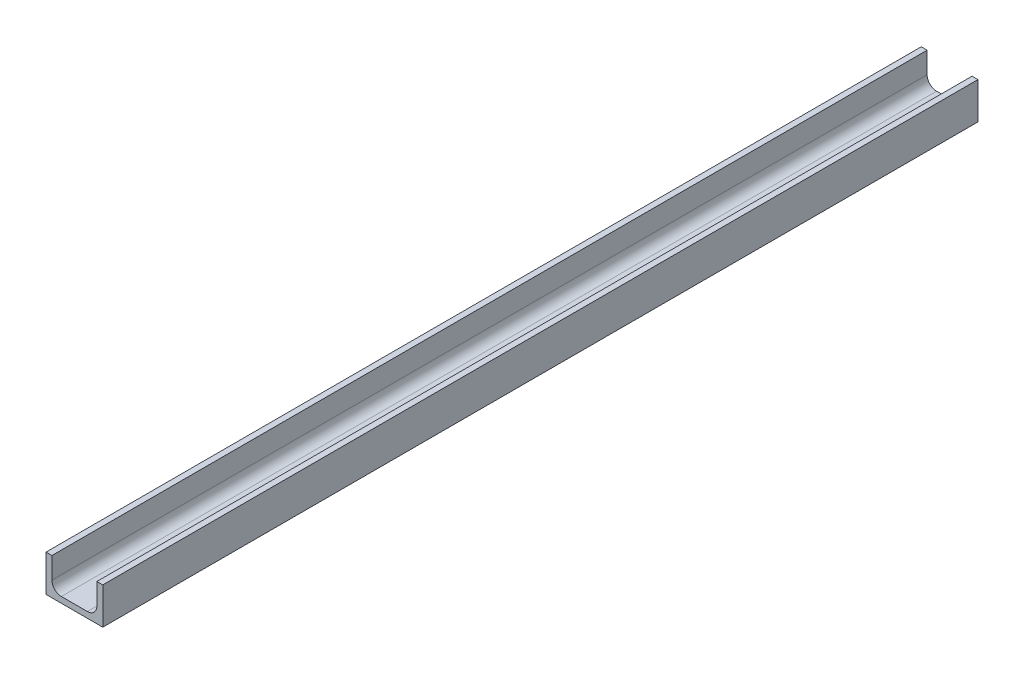
ISO-10303-21;
HEADER;
FILE_DESCRIPTION(('STEP AP214'),'2;1');
FILE_NAME('part.step','',(''),(''),'','','');
FILE_SCHEMA(('AUTOMOTIVE_DESIGN { 1 0 10303 214 1 1 1 1 }'));
ENDSEC;
DATA;
#1=APPLICATION_CONTEXT('core data for automotive mechanical design processes');
#2=APPLICATION_PROTOCOL_DEFINITION('international standard','automotive_design',2000,#1);
#3=PRODUCT_CONTEXT('',#1,'mechanical');
#4=PRODUCT('Part','Part','',(#3));
#5=PRODUCT_RELATED_PRODUCT_CATEGORY('part','',(#4));
#6=PRODUCT_DEFINITION_FORMATION('','',#4);
#7=PRODUCT_DEFINITION_CONTEXT('part definition',#1,'design');
#8=PRODUCT_DEFINITION('design','',#6,#7);
#9=PRODUCT_DEFINITION_SHAPE('','',#8);
#10=(LENGTH_UNIT() NAMED_UNIT(*) SI_UNIT(.MILLI.,.METRE.));
#11=(NAMED_UNIT(*) PLANE_ANGLE_UNIT() SI_UNIT($,.RADIAN.));
#12=(NAMED_UNIT(*) SI_UNIT($,.STERADIAN.) SOLID_ANGLE_UNIT());
#13=UNCERTAINTY_MEASURE_WITH_UNIT(LENGTH_MEASURE(1.E-05),#10,'distance_accuracy_value','');
#14=(GEOMETRIC_REPRESENTATION_CONTEXT(3) GLOBAL_UNCERTAINTY_ASSIGNED_CONTEXT((#13)) GLOBAL_UNIT_ASSIGNED_CONTEXT((#10,
#11,#12)) REPRESENTATION_CONTEXT('',''));
#15=CARTESIAN_POINT('',(0.,0.,0.));
#16=DIRECTION('',(0.,0.,1.));
#17=DIRECTION('',(1.,0.,0.));
#18=AXIS2_PLACEMENT_3D('',#15,#16,#17);
#19=CARTESIAN_POINT('',(76.2,0.,1174.75));
#20=DIRECTION('',(0.,1.,0.));
#21=DIRECTION('',(-1.,0.,0.));
#22=AXIS2_PLACEMENT_3D('',#19,#20,#21);
#23=PLANE('',#22);
#24=CARTESIAN_POINT('',(38.1,0.,968.375));
#25=DIRECTION('',(0.,1.,0.));
#26=DIRECTION('',(-1.,0.,0.));
#27=AXIS2_PLACEMENT_3D('',#24,#25,#26);
#28=CIRCLE('',#27,25.146);
#29=CARTESIAN_POINT('',(12.954,0.,968.375));
#30=VERTEX_POINT('',#29);
#31=EDGE_CURVE('E40',#30,#30,#28,.F.);
#32=ORIENTED_EDGE('',*,*,#31,.F.);
#33=EDGE_LOOP('',(#32));
#34=FACE_BOUND('',#33,.T.);
#35=DIRECTION('',(1.,0.,0.));
#36=VECTOR('',#35,1.);
#37=CARTESIAN_POINT('',(76.2,0.,0.));
#38=LINE('',#37,#36);
#39=CARTESIAN_POINT('',(0.,0.,0.));
#40=VERTEX_POINT('',#39);
#41=CARTESIAN_POINT('',(76.2,0.,0.));
#42=VERTEX_POINT('',#41);
#43=EDGE_CURVE('E141',#40,#42,#38,.T.);
#44=ORIENTED_EDGE('',*,*,#43,.T.);
#45=DIRECTION('',(0.,0.,-1.));
#46=VECTOR('',#45,1.);
#47=CARTESIAN_POINT('',(76.2,0.,1174.75));
#48=LINE('',#47,#46);
#49=CARTESIAN_POINT('',(76.2,0.,1174.75));
#50=VERTEX_POINT('',#49);
#51=EDGE_CURVE('E179',#50,#42,#48,.T.);
#52=ORIENTED_EDGE('',*,*,#51,.F.);
#53=DIRECTION('',(1.,0.,0.));
#54=VECTOR('',#53,1.);
#55=CARTESIAN_POINT('',(76.2,0.,1174.75));
#56=LINE('',#55,#54);
#57=CARTESIAN_POINT('',(0.,0.,1174.75));
#58=VERTEX_POINT('',#57);
#59=EDGE_CURVE('E160',#58,#50,#56,.T.);
#60=ORIENTED_EDGE('',*,*,#59,.F.);
#61=DIRECTION('',(0.,0.,-1.));
#62=VECTOR('',#61,1.);
#63=CARTESIAN_POINT('',(0.,0.,1174.75));
#64=LINE('',#63,#62);
#65=EDGE_CURVE('E137',#58,#40,#64,.T.);
#66=ORIENTED_EDGE('',*,*,#65,.T.);
#67=EDGE_LOOP('',(#44,#52,#60,#66));
#68=FACE_BOUND('',#67,.T.);
#69=CARTESIAN_POINT('',(38.1,0.,206.375));
#70=DIRECTION('',(0.,1.,0.));
#71=DIRECTION('',(-1.,0.,0.));
#72=AXIS2_PLACEMENT_3D('',#69,#70,#71);
#73=CIRCLE('',#72,25.146);
#74=CARTESIAN_POINT('',(12.954,0.,206.375));
#75=VERTEX_POINT('',#74);
#76=EDGE_CURVE('E11',#75,#75,#73,.F.);
#77=ORIENTED_EDGE('',*,*,#76,.F.);
#78=EDGE_LOOP('',(#77));
#79=FACE_BOUND('',#78,.T.);
#80=ADVANCED_FACE('F32',(#34,#68,#79),#23,.F.);
#81=CARTESIAN_POINT('',(76.2,49.2252,1174.75));
#82=DIRECTION('',(-1.,0.,0.));
#83=DIRECTION('',(0.,0.,1.));
#84=AXIS2_PLACEMENT_3D('',#81,#82,#83);
#85=PLANE('',#84);
#86=DIRECTION('',(0.,1.,0.));
#87=VECTOR('',#86,1.);
#88=CARTESIAN_POINT('',(76.2,49.2252,0.));
#89=LINE('',#88,#87);
#90=CARTESIAN_POINT('',(76.2,49.2252,0.));
#91=VERTEX_POINT('',#90);
#92=EDGE_CURVE('E144',#42,#91,#89,.T.);
#93=ORIENTED_EDGE('',*,*,#92,.T.);
#94=DIRECTION('',(0.,0.,-1.));
#95=VECTOR('',#94,1.);
#96=CARTESIAN_POINT('',(76.2,49.2252,1174.75));
#97=LINE('',#96,#95);
#98=CARTESIAN_POINT('',(76.2,49.2252,1174.75));
#99=VERTEX_POINT('',#98);
#100=EDGE_CURVE('E176',#99,#91,#97,.T.);
#101=ORIENTED_EDGE('',*,*,#100,.F.);
#102=DIRECTION('',(0.,1.,0.));
#103=VECTOR('',#102,1.);
#104=CARTESIAN_POINT('',(76.2,49.2252,1174.75));
#105=LINE('',#104,#103);
#106=EDGE_CURVE('E98',#50,#99,#105,.T.);
#107=ORIENTED_EDGE('',*,*,#106,.F.);
#108=ORIENTED_EDGE('',*,*,#51,.T.);
#109=EDGE_LOOP('',(#93,#101,#107,#108));
#110=FACE_BOUND('',#109,.T.);
#111=ADVANCED_FACE('F190',(#110),#85,.F.);
#112=CARTESIAN_POINT('',(68.2752,49.2252,1174.75));
#113=DIRECTION('',(0.,-1.,0.));
#114=DIRECTION('',(0.,0.,-1.));
#115=AXIS2_PLACEMENT_3D('',#112,#113,#114);
#116=PLANE('',#115);
#117=DIRECTION('',(-1.,0.,0.));
#118=VECTOR('',#117,1.);
#119=CARTESIAN_POINT('',(68.2752,49.2252,0.));
#120=LINE('',#119,#118);
#121=CARTESIAN_POINT('',(68.2752,49.2252,0.));
#122=VERTEX_POINT('',#121);
#123=EDGE_CURVE('E147',#91,#122,#120,.T.);
#124=ORIENTED_EDGE('',*,*,#123,.T.);
#125=DIRECTION('',(0.,0.,-1.));
#126=VECTOR('',#125,1.);
#127=CARTESIAN_POINT('',(68.2752,49.2252,1174.75));
#128=LINE('',#127,#126);
#129=CARTESIAN_POINT('',(68.2752,49.2252,1174.75));
#130=VERTEX_POINT('',#129);
#131=EDGE_CURVE('E173',#130,#122,#128,.T.);
#132=ORIENTED_EDGE('',*,*,#131,.F.);
#133=DIRECTION('',(-1.,0.,0.));
#134=VECTOR('',#133,1.);
#135=CARTESIAN_POINT('',(68.2752,49.2252,1174.75));
#136=LINE('',#135,#134);
#137=EDGE_CURVE('E261',#99,#130,#136,.T.);
#138=ORIENTED_EDGE('',*,*,#137,.F.);
#139=ORIENTED_EDGE('',*,*,#100,.T.);
#140=EDGE_LOOP('',(#124,#132,#138,#139));
#141=FACE_BOUND('',#140,.T.);
#142=ADVANCED_FACE('F251',(#141),#116,.F.);
#143=CARTESIAN_POINT('',(68.2752,20.6248,1174.75));
#144=DIRECTION('',(1.,0.,0.));
#145=DIRECTION('',(0.,0.,-1.));
#146=AXIS2_PLACEMENT_3D('',#143,#144,#145);
#147=PLANE('',#146);
#148=DIRECTION('',(0.,-1.,0.));
#149=VECTOR('',#148,1.);
#150=CARTESIAN_POINT('',(68.2752,20.6248,0.));
#151=LINE('',#150,#149);
#152=CARTESIAN_POINT('',(68.2752,20.6248,0.));
#153=VERTEX_POINT('',#152);
#154=EDGE_CURVE('E149',#122,#153,#151,.T.);
#155=ORIENTED_EDGE('',*,*,#154,.T.);
#156=DIRECTION('',(0.,0.,-1.));
#157=VECTOR('',#156,1.);
#158=CARTESIAN_POINT('',(68.2752,20.6248,1174.75));
#159=LINE('',#158,#157);
#160=CARTESIAN_POINT('',(68.2752,20.6248,1174.75));
#161=VERTEX_POINT('',#160);
#162=EDGE_CURVE('E170',#161,#153,#159,.T.);
#163=ORIENTED_EDGE('',*,*,#162,.F.);
#164=DIRECTION('',(0.,-1.,0.));
#165=VECTOR('',#164,1.);
#166=CARTESIAN_POINT('',(68.2752,20.6248,1174.75));
#167=LINE('',#166,#165);
#168=EDGE_CURVE('E272',#130,#161,#167,.T.);
#169=ORIENTED_EDGE('',*,*,#168,.F.);
#170=ORIENTED_EDGE('',*,*,#131,.T.);
#171=EDGE_LOOP('',(#155,#163,#169,#170));
#172=FACE_BOUND('',#171,.T.);
#173=ADVANCED_FACE('F247',(#172),#147,.F.);
#174=CARTESIAN_POINT('',(55.5752,20.6248,1174.75));
#175=DIRECTION('',(0.,0.,-1.));
#176=DIRECTION('',(-1.,0.,0.));
#177=AXIS2_PLACEMENT_3D('',#174,#175,#176);
#178=CYLINDRICAL_SURFACE('',#177,12.7);
#179=CARTESIAN_POINT('',(55.5752,20.6248,0.));
#180=DIRECTION('',(0.,0.,-1.));
#181=DIRECTION('',(-1.,0.,0.));
#182=AXIS2_PLACEMENT_3D('',#179,#180,#181);
#183=CIRCLE('',#182,12.7);
#184=CARTESIAN_POINT('',(55.5752,7.92479999999999,0.));
#185=VERTEX_POINT('',#184);
#186=EDGE_CURVE('E151',#153,#185,#183,.T.);
#187=ORIENTED_EDGE('',*,*,#186,.T.);
#188=DIRECTION('',(0.,0.,-1.));
#189=VECTOR('',#188,1.);
#190=CARTESIAN_POINT('',(55.5752,7.92479999999999,1174.75));
#191=LINE('',#190,#189);
#192=CARTESIAN_POINT('',(55.5752,7.92479999999999,1174.75));
#193=VERTEX_POINT('',#192);
#194=EDGE_CURVE('E167',#193,#185,#191,.T.);
#195=ORIENTED_EDGE('',*,*,#194,.F.);
#196=CARTESIAN_POINT('',(55.5752,20.6248,1174.75));
#197=DIRECTION('',(0.,0.,-1.));
#198=DIRECTION('',(-1.,0.,0.));
#199=AXIS2_PLACEMENT_3D('',#196,#197,#198);
#200=CIRCLE('',#199,12.7);
#201=EDGE_CURVE('E269',#161,#193,#200,.T.);
#202=ORIENTED_EDGE('',*,*,#201,.F.);
#203=ORIENTED_EDGE('',*,*,#162,.T.);
#204=EDGE_LOOP('',(#187,#195,#202,#203));
#205=FACE_BOUND('',#204,.T.);
#206=ADVANCED_FACE('F243',(#205),#178,.F.);
#207=CARTESIAN_POINT('',(20.6248,7.92479999999999,1174.75));
#208=DIRECTION('',(0.,-1.,0.));
#209=DIRECTION('',(0.,0.,-1.));
#210=AXIS2_PLACEMENT_3D('',#207,#208,#209);
#211=PLANE('',#210);
#212=CARTESIAN_POINT('',(38.1,7.92479999999999,206.375));
#213=DIRECTION('',(0.,-1.,0.));
#214=DIRECTION('',(0.,0.,-1.));
#215=AXIS2_PLACEMENT_3D('',#212,#213,#214);
#216=CIRCLE('',#215,6.54811999999999);
#217=CARTESIAN_POINT('',(38.1,7.92479999999999,199.82688));
#218=VERTEX_POINT('',#217);
#219=EDGE_CURVE('E182',#218,#218,#216,.T.);
#220=ORIENTED_EDGE('',*,*,#219,.T.);
#221=EDGE_LOOP('',(#220));
#222=FACE_BOUND('',#221,.T.);
#223=CARTESIAN_POINT('',(38.1,7.92479999999999,968.375));
#224=DIRECTION('',(0.,-1.,0.));
#225=DIRECTION('',(0.,0.,-1.));
#226=AXIS2_PLACEMENT_3D('',#223,#224,#225);
#227=CIRCLE('',#226,6.54811999999999);
#228=CARTESIAN_POINT('',(38.1,7.92479999999999,961.82688));
#229=VERTEX_POINT('',#228);
#230=EDGE_CURVE('E145',#229,#229,#227,.T.);
#231=ORIENTED_EDGE('',*,*,#230,.T.);
#232=EDGE_LOOP('',(#231));
#233=FACE_BOUND('',#232,.T.);
#234=DIRECTION('',(-1.,0.,0.));
#235=VECTOR('',#234,1.);
#236=CARTESIAN_POINT('',(20.6248,7.92479999999999,0.));
#237=LINE('',#236,#235);
#238=CARTESIAN_POINT('',(20.6248,7.92479999999999,0.));
#239=VERTEX_POINT('',#238);
#240=EDGE_CURVE('E153',#185,#239,#237,.T.);
#241=ORIENTED_EDGE('',*,*,#240,.T.);
#242=DIRECTION('',(0.,0.,-1.));
#243=VECTOR('',#242,1.);
#244=CARTESIAN_POINT('',(20.6248,7.92479999999999,1174.75));
#245=LINE('',#244,#243);
#246=CARTESIAN_POINT('',(20.6248,7.92479999999999,1174.75));
#247=VERTEX_POINT('',#246);
#248=EDGE_CURVE('E164',#247,#239,#245,.T.);
#249=ORIENTED_EDGE('',*,*,#248,.F.);
#250=DIRECTION('',(-1.,0.,0.));
#251=VECTOR('',#250,1.);
#252=CARTESIAN_POINT('',(20.6248,7.92479999999999,1174.75));
#253=LINE('',#252,#251);
#254=EDGE_CURVE('E271',#193,#247,#253,.T.);
#255=ORIENTED_EDGE('',*,*,#254,.F.);
#256=ORIENTED_EDGE('',*,*,#194,.T.);
#257=EDGE_LOOP('',(#241,#249,#255,#256));
#258=FACE_BOUND('',#257,.T.);
#259=ADVANCED_FACE('F239',(#222,#233,#258),#211,.F.);
#260=CARTESIAN_POINT('',(20.6248,20.6248,1174.75));
#261=DIRECTION('',(0.,0.,-1.));
#262=DIRECTION('',(-1.,0.,0.));
#263=AXIS2_PLACEMENT_3D('',#260,#261,#262);
#264=CYLINDRICAL_SURFACE('',#263,12.7);
#265=CARTESIAN_POINT('',(20.6248,20.6248,0.));
#266=DIRECTION('',(0.,0.,-1.));
#267=DIRECTION('',(1.,0.,0.));
#268=AXIS2_PLACEMENT_3D('',#265,#266,#267);
#269=CIRCLE('',#268,12.7);
#270=CARTESIAN_POINT('',(7.9248,20.6248,0.));
#271=VERTEX_POINT('',#270);
#272=EDGE_CURVE('E155',#239,#271,#269,.T.);
#273=ORIENTED_EDGE('',*,*,#272,.T.);
#274=DIRECTION('',(0.,0.,-1.));
#275=VECTOR('',#274,1.);
#276=CARTESIAN_POINT('',(7.9248,20.6248,1174.75));
#277=LINE('',#276,#275);
#278=CARTESIAN_POINT('',(7.9248,20.6248,1174.75));
#279=VERTEX_POINT('',#278);
#280=EDGE_CURVE('E132',#279,#271,#277,.T.);
#281=ORIENTED_EDGE('',*,*,#280,.F.);
#282=CARTESIAN_POINT('',(20.6248,20.6248,1174.75));
#283=DIRECTION('',(0.,0.,-1.));
#284=DIRECTION('',(1.,0.,0.));
#285=AXIS2_PLACEMENT_3D('',#282,#283,#284);
#286=CIRCLE('',#285,12.7);
#287=EDGE_CURVE('E123',#247,#279,#286,.T.);
#288=ORIENTED_EDGE('',*,*,#287,.F.);
#289=ORIENTED_EDGE('',*,*,#248,.T.);
#290=EDGE_LOOP('',(#273,#281,#288,#289));
#291=FACE_BOUND('',#290,.T.);
#292=ADVANCED_FACE('F236',(#291),#264,.F.);
#293=CARTESIAN_POINT('',(7.9248,49.2252,1174.75));
#294=DIRECTION('',(-1.,0.,0.));
#295=DIRECTION('',(0.,-1.,0.));
#296=AXIS2_PLACEMENT_3D('',#293,#294,#295);
#297=PLANE('',#296);
#298=DIRECTION('',(0.,1.,0.));
#299=VECTOR('',#298,1.);
#300=CARTESIAN_POINT('',(7.9248,49.2252,0.));
#301=LINE('',#300,#299);
#302=CARTESIAN_POINT('',(7.9248,49.2252,0.));
#303=VERTEX_POINT('',#302);
#304=EDGE_CURVE('E131',#271,#303,#301,.T.);
#305=ORIENTED_EDGE('',*,*,#304,.T.);
#306=DIRECTION('',(0.,0.,-1.));
#307=VECTOR('',#306,1.);
#308=CARTESIAN_POINT('',(7.9248,49.2252,1174.75));
#309=LINE('',#308,#307);
#310=CARTESIAN_POINT('',(7.9248,49.2252,1174.75));
#311=VERTEX_POINT('',#310);
#312=EDGE_CURVE('E128',#311,#303,#309,.T.);
#313=ORIENTED_EDGE('',*,*,#312,.F.);
#314=DIRECTION('',(0.,1.,0.));
#315=VECTOR('',#314,1.);
#316=CARTESIAN_POINT('',(7.9248,49.2252,1174.75));
#317=LINE('',#316,#315);
#318=EDGE_CURVE('E117',#279,#311,#317,.T.);
#319=ORIENTED_EDGE('',*,*,#318,.F.);
#320=ORIENTED_EDGE('',*,*,#280,.T.);
#321=EDGE_LOOP('',(#305,#313,#319,#320));
#322=FACE_BOUND('',#321,.T.);
#323=ADVANCED_FACE('F129',(#322),#297,.F.);
#324=CARTESIAN_POINT('',(0.,49.2252,1174.75));
#325=DIRECTION('',(0.,-1.,0.));
#326=DIRECTION('',(0.,0.,-1.));
#327=AXIS2_PLACEMENT_3D('',#324,#325,#326);
#328=PLANE('',#327);
#329=DIRECTION('',(-1.,0.,0.));
#330=VECTOR('',#329,1.);
#331=CARTESIAN_POINT('',(0.,49.2252,0.));
#332=LINE('',#331,#330);
#333=CARTESIAN_POINT('',(0.,49.2252,0.));
#334=VERTEX_POINT('',#333);
#335=EDGE_CURVE('E83',#303,#334,#332,.T.);
#336=ORIENTED_EDGE('',*,*,#335,.T.);
#337=DIRECTION('',(0.,0.,-1.));
#338=VECTOR('',#337,1.);
#339=CARTESIAN_POINT('',(0.,49.2252,1174.75));
#340=LINE('',#339,#338);
#341=CARTESIAN_POINT('',(0.,49.2252,1174.75));
#342=VERTEX_POINT('',#341);
#343=EDGE_CURVE('E133',#342,#334,#340,.T.);
#344=ORIENTED_EDGE('',*,*,#343,.F.);
#345=DIRECTION('',(-1.,0.,0.));
#346=VECTOR('',#345,1.);
#347=CARTESIAN_POINT('',(0.,49.2252,1174.75));
#348=LINE('',#347,#346);
#349=EDGE_CURVE('E121',#311,#342,#348,.T.);
#350=ORIENTED_EDGE('',*,*,#349,.F.);
#351=ORIENTED_EDGE('',*,*,#312,.T.);
#352=EDGE_LOOP('',(#336,#344,#350,#351));
#353=FACE_BOUND('',#352,.T.);
#354=ADVANCED_FACE('F135',(#353),#328,.F.);
#355=CARTESIAN_POINT('',(0.,0.,1174.75));
#356=DIRECTION('',(1.,0.,0.));
#357=DIRECTION('',(0.,0.,-1.));
#358=AXIS2_PLACEMENT_3D('',#355,#356,#357);
#359=PLANE('',#358);
#360=DIRECTION('',(0.,-1.,0.));
#361=VECTOR('',#360,1.);
#362=CARTESIAN_POINT('',(0.,0.,0.));
#363=LINE('',#362,#361);
#364=EDGE_CURVE('E89',#334,#40,#363,.T.);
#365=ORIENTED_EDGE('',*,*,#364,.T.);
#366=ORIENTED_EDGE('',*,*,#65,.F.);
#367=DIRECTION('',(0.,-1.,0.));
#368=VECTOR('',#367,1.);
#369=CARTESIAN_POINT('',(0.,0.,1174.75));
#370=LINE('',#369,#368);
#371=EDGE_CURVE('E48',#342,#58,#370,.T.);
#372=ORIENTED_EDGE('',*,*,#371,.F.);
#373=ORIENTED_EDGE('',*,*,#343,.T.);
#374=EDGE_LOOP('',(#365,#366,#372,#373));
#375=FACE_BOUND('',#374,.T.);
#376=ADVANCED_FACE('F226',(#375),#359,.F.);
#377=CARTESIAN_POINT('',(20.6248,20.6248,1174.75));
#378=DIRECTION('',(0.,0.,1.));
#379=DIRECTION('',(1.,0.,0.));
#380=AXIS2_PLACEMENT_3D('',#377,#378,#379);
#381=PLANE('',#380);
#382=ORIENTED_EDGE('',*,*,#59,.T.);
#383=ORIENTED_EDGE('',*,*,#106,.T.);
#384=ORIENTED_EDGE('',*,*,#137,.T.);
#385=ORIENTED_EDGE('',*,*,#168,.T.);
#386=ORIENTED_EDGE('',*,*,#201,.T.);
#387=ORIENTED_EDGE('',*,*,#254,.T.);
#388=ORIENTED_EDGE('',*,*,#287,.T.);
#389=ORIENTED_EDGE('',*,*,#318,.T.);
#390=ORIENTED_EDGE('',*,*,#349,.T.);
#391=ORIENTED_EDGE('',*,*,#371,.T.);
#392=EDGE_LOOP('',(#382,#383,#384,#385,#386,#387,#388,#389,#390,#391));
#393=FACE_BOUND('',#392,.T.);
#394=ADVANCED_FACE('F119',(#393),#381,.T.);
#395=CARTESIAN_POINT('',(20.6248,20.6248,0.));
#396=DIRECTION('',(0.,0.,1.));
#397=DIRECTION('',(1.,0.,0.));
#398=AXIS2_PLACEMENT_3D('',#395,#396,#397);
#399=PLANE('',#398);
#400=ORIENTED_EDGE('',*,*,#43,.F.);
#401=ORIENTED_EDGE('',*,*,#364,.F.);
#402=ORIENTED_EDGE('',*,*,#335,.F.);
#403=ORIENTED_EDGE('',*,*,#304,.F.);
#404=ORIENTED_EDGE('',*,*,#272,.F.);
#405=ORIENTED_EDGE('',*,*,#240,.F.);
#406=ORIENTED_EDGE('',*,*,#186,.F.);
#407=ORIENTED_EDGE('',*,*,#154,.F.);
#408=ORIENTED_EDGE('',*,*,#123,.F.);
#409=ORIENTED_EDGE('',*,*,#92,.F.);
#410=EDGE_LOOP('',(#400,#401,#402,#403,#404,#405,#406,#407,#408,#409));
#411=FACE_BOUND('',#410,.T.);
#412=ADVANCED_FACE('F222',(#411),#399,.F.);
#413=CARTESIAN_POINT('',(38.1,0.,968.375));
#414=DIRECTION('',(0.,-1.,0.));
#415=DIRECTION('',(0.,0.,-1.));
#416=AXIS2_PLACEMENT_3D('',#413,#414,#415);
#417=CYLINDRICAL_SURFACE('',#416,6.54811999999999);
#418=ORIENTED_EDGE('',*,*,#230,.F.);
#419=EDGE_LOOP('',(#418));
#420=FACE_BOUND('',#419,.T.);
#421=CARTESIAN_POINT('',(38.1,-4.953,968.375));
#422=DIRECTION('',(0.,-1.,0.));
#423=DIRECTION('',(1.,0.,0.));
#424=AXIS2_PLACEMENT_3D('',#421,#422,#423);
#425=CIRCLE('',#424,6.54811999999991);
#426=CARTESIAN_POINT('',(44.6481199999999,-4.953,968.375));
#427=VERTEX_POINT('',#426);
#428=EDGE_CURVE('E285',#427,#427,#425,.T.);
#429=ORIENTED_EDGE('',*,*,#428,.T.);
#430=EDGE_LOOP('',(#429));
#431=FACE_BOUND('',#430,.T.);
#432=ADVANCED_FACE('F218',(#420,#431),#417,.F.);
#433=CARTESIAN_POINT('',(38.1,0.,206.375));
#434=DIRECTION('',(0.,-1.,0.));
#435=DIRECTION('',(0.,0.,-1.));
#436=AXIS2_PLACEMENT_3D('',#433,#434,#435);
#437=CYLINDRICAL_SURFACE('',#436,6.54811999999999);
#438=ORIENTED_EDGE('',*,*,#219,.F.);
#439=EDGE_LOOP('',(#438));
#440=FACE_BOUND('',#439,.T.);
#441=CARTESIAN_POINT('',(38.1,-4.953,206.375));
#442=DIRECTION('',(0.,-1.,0.));
#443=DIRECTION('',(1.,0.,0.));
#444=AXIS2_PLACEMENT_3D('',#441,#442,#443);
#445=CIRCLE('',#444,6.54811999999999);
#446=CARTESIAN_POINT('',(44.64812,-4.953,206.375));
#447=VERTEX_POINT('',#446);
#448=EDGE_CURVE('E291',#447,#447,#445,.T.);
#449=ORIENTED_EDGE('',*,*,#448,.T.);
#450=EDGE_LOOP('',(#449));
#451=FACE_BOUND('',#450,.T.);
#452=ADVANCED_FACE('F211',(#440,#451),#437,.F.);
#453=CARTESIAN_POINT('',(38.1,-4.953,968.375));
#454=DIRECTION('',(0.,-1.,0.));
#455=DIRECTION('',(1.,0.,0.));
#456=AXIS2_PLACEMENT_3D('',#453,#454,#455);
#457=PLANE('',#456);
#458=CARTESIAN_POINT('',(38.1,-4.953,968.375));
#459=DIRECTION('',(0.,-1.,0.));
#460=DIRECTION('',(1.,0.,0.));
#461=AXIS2_PLACEMENT_3D('',#458,#459,#460);
#462=CIRCLE('',#461,25.146);
#463=CARTESIAN_POINT('',(63.246,-4.953,968.375));
#464=VERTEX_POINT('',#463);
#465=EDGE_CURVE('E282',#464,#464,#462,.T.);
#466=ORIENTED_EDGE('',*,*,#465,.T.);
#467=EDGE_LOOP('',(#466));
#468=FACE_BOUND('',#467,.T.);
#469=ORIENTED_EDGE('',*,*,#428,.F.);
#470=EDGE_LOOP('',(#469));
#471=FACE_BOUND('',#470,.T.);
#472=ADVANCED_FACE('F208',(#468,#471),#457,.T.);
#473=CARTESIAN_POINT('',(38.1,-4.953,968.375));
#474=DIRECTION('',(0.,1.,0.));
#475=DIRECTION('',(-1.,0.,0.));
#476=AXIS2_PLACEMENT_3D('',#473,#474,#475);
#477=CYLINDRICAL_SURFACE('',#476,25.146);
#478=ORIENTED_EDGE('',*,*,#465,.F.);
#479=EDGE_LOOP('',(#478));
#480=FACE_BOUND('',#479,.T.);
#481=ORIENTED_EDGE('',*,*,#31,.T.);
#482=EDGE_LOOP('',(#481));
#483=FACE_BOUND('',#482,.T.);
#484=ADVANCED_FACE('F186',(#480,#483),#477,.T.);
#485=CARTESIAN_POINT('',(38.1,-4.953,206.375));
#486=DIRECTION('',(0.,-1.,0.));
#487=DIRECTION('',(1.,0.,0.));
#488=AXIS2_PLACEMENT_3D('',#485,#486,#487);
#489=PLANE('',#488);
#490=CARTESIAN_POINT('',(38.1,-4.953,206.375));
#491=DIRECTION('',(0.,-1.,0.));
#492=DIRECTION('',(1.,0.,0.));
#493=AXIS2_PLACEMENT_3D('',#490,#491,#492);
#494=CIRCLE('',#493,25.146);
#495=CARTESIAN_POINT('',(63.246,-4.953,206.375));
#496=VERTEX_POINT('',#495);
#497=EDGE_CURVE('E288',#496,#496,#494,.T.);
#498=ORIENTED_EDGE('',*,*,#497,.T.);
#499=EDGE_LOOP('',(#498));
#500=FACE_BOUND('',#499,.T.);
#501=ORIENTED_EDGE('',*,*,#448,.F.);
#502=EDGE_LOOP('',(#501));
#503=FACE_BOUND('',#502,.T.);
#504=ADVANCED_FACE('F198',(#500,#503),#489,.T.);
#505=CARTESIAN_POINT('',(38.1,-4.953,206.375));
#506=DIRECTION('',(0.,1.,0.));
#507=DIRECTION('',(-1.,0.,0.));
#508=AXIS2_PLACEMENT_3D('',#505,#506,#507);
#509=CYLINDRICAL_SURFACE('',#508,25.146);
#510=ORIENTED_EDGE('',*,*,#497,.F.);
#511=EDGE_LOOP('',(#510));
#512=FACE_BOUND('',#511,.T.);
#513=ORIENTED_EDGE('',*,*,#76,.T.);
#514=EDGE_LOOP('',(#513));
#515=FACE_BOUND('',#514,.T.);
#516=ADVANCED_FACE('F196',(#512,#515),#509,.T.);
#517=CLOSED_SHELL('',(#80,#111,#142,#173,#206,#259,#292,#323,#354,#376,#394,#412,#432,#452,#472,
#484,#504,#516));
#518=MANIFOLD_SOLID_BREP('B2',#517);
#519=ADVANCED_BREP_SHAPE_REPRESENTATION('',(#18,#518),#14);
#520=SHAPE_DEFINITION_REPRESENTATION(#9,#519);
ENDSEC;
END-ISO-10303-21;
